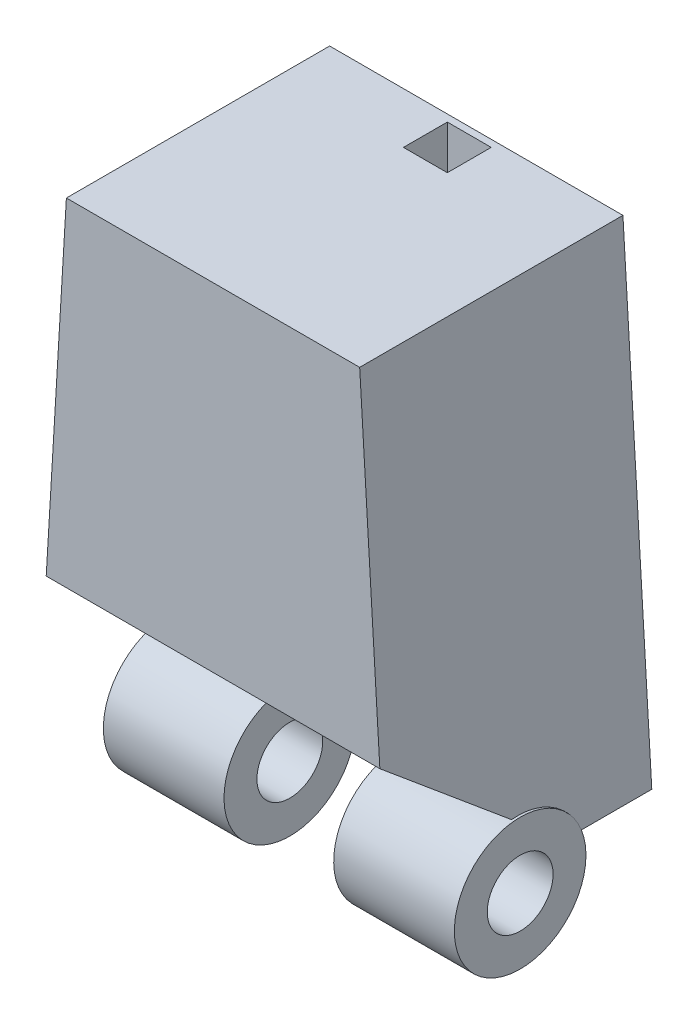
ISO-10303-21;
HEADER;
FILE_DESCRIPTION(('STEP AP214'),'2;1');
FILE_NAME('part.step','',(''),(''),'','','');
FILE_SCHEMA(('AUTOMOTIVE_DESIGN { 1 0 10303 214 1 1 1 1 }'));
ENDSEC;
DATA;
#1=APPLICATION_CONTEXT('core data for automotive mechanical design processes');
#2=APPLICATION_PROTOCOL_DEFINITION('international standard','automotive_design',2000,#1);
#3=PRODUCT_CONTEXT('',#1,'mechanical');
#4=PRODUCT('Part','Part','',(#3));
#5=PRODUCT_RELATED_PRODUCT_CATEGORY('part','',(#4));
#6=PRODUCT_DEFINITION_FORMATION('','',#4);
#7=PRODUCT_DEFINITION_CONTEXT('part definition',#1,'design');
#8=PRODUCT_DEFINITION('design','',#6,#7);
#9=PRODUCT_DEFINITION_SHAPE('','',#8);
#10=(LENGTH_UNIT() NAMED_UNIT(*) SI_UNIT(.MILLI.,.METRE.));
#11=(NAMED_UNIT(*) PLANE_ANGLE_UNIT() SI_UNIT($,.RADIAN.));
#12=(NAMED_UNIT(*) SI_UNIT($,.STERADIAN.) SOLID_ANGLE_UNIT());
#13=UNCERTAINTY_MEASURE_WITH_UNIT(LENGTH_MEASURE(1.E-05),#10,'distance_accuracy_value','');
#14=(GEOMETRIC_REPRESENTATION_CONTEXT(3) GLOBAL_UNCERTAINTY_ASSIGNED_CONTEXT((#13)) GLOBAL_UNIT_ASSIGNED_CONTEXT((#10,
#11,#12)) REPRESENTATION_CONTEXT('',''));
#15=CARTESIAN_POINT('',(0.,0.,0.));
#16=DIRECTION('',(0.,0.,1.));
#17=DIRECTION('',(1.,0.,0.));
#18=AXIS2_PLACEMENT_3D('',#15,#16,#17);
#19=CARTESIAN_POINT('',(-56.5742777997626,0.,12.));
#20=DIRECTION('',(0.,1.,0.));
#21=DIRECTION('',(0.,0.,1.));
#22=AXIS2_PLACEMENT_3D('',#19,#20,#21);
#23=PLANE('',#22);
#24=DIRECTION('',(-1.,0.,0.));
#25=VECTOR('',#24,1.);
#26=CARTESIAN_POINT('',(-40.5742777997626,0.,3.20894285260943));
#27=LINE('',#26,#25);
#28=CARTESIAN_POINT('',(-56.5742777997626,0.,3.20894285260943));
#29=VERTEX_POINT('',#28);
#30=CARTESIAN_POINT('',(-51.0742777997626,0.,3.20894285260943));
#31=VERTEX_POINT('',#30);
#32=EDGE_CURVE('E294',#29,#31,#27,.F.);
#33=ORIENTED_EDGE('',*,*,#32,.F.);
#34=DIRECTION('',(0.,0.,-1.));
#35=VECTOR('',#34,1.);
#36=CARTESIAN_POINT('',(-56.5742777997626,0.,12.));
#37=LINE('',#36,#35);
#38=CARTESIAN_POINT('',(-56.5742777997626,0.,0.));
#39=VERTEX_POINT('',#38);
#40=EDGE_CURVE('E340',#29,#39,#37,.T.);
#41=ORIENTED_EDGE('',*,*,#40,.T.);
#42=DIRECTION('',(1.,0.,0.));
#43=VECTOR('',#42,1.);
#44=CARTESIAN_POINT('',(-56.5742777997626,0.,0.));
#45=LINE('',#44,#43);
#46=CARTESIAN_POINT('',(-40.5742777997626,0.,0.));
#47=VERTEX_POINT('',#46);
#48=EDGE_CURVE('E324',#39,#47,#45,.T.);
#49=ORIENTED_EDGE('',*,*,#48,.T.);
#50=DIRECTION('',(0.,0.,-1.));
#51=VECTOR('',#50,1.);
#52=CARTESIAN_POINT('',(-40.5742777997626,0.,12.));
#53=LINE('',#52,#51);
#54=CARTESIAN_POINT('',(-40.5742777997626,0.,3.20894285260943));
#55=VERTEX_POINT('',#54);
#56=EDGE_CURVE('E337',#55,#47,#53,.T.);
#57=ORIENTED_EDGE('',*,*,#56,.F.);
#58=CARTESIAN_POINT('',(-46.0742777997626,0.,3.20894285260943));
#59=VERTEX_POINT('',#58);
#60=EDGE_CURVE('E293',#59,#55,#27,.F.);
#61=ORIENTED_EDGE('',*,*,#60,.F.);
#62=EDGE_CURVE('E299',#31,#59,#27,.F.);
#63=ORIENTED_EDGE('',*,*,#62,.F.);
#64=EDGE_LOOP('',(#33,#41,#49,#57,#61,#63));
#65=FACE_BOUND('',#64,.T.);
#66=DIRECTION('',(0.,0.,-1.));
#67=VECTOR('',#66,1.);
#68=CARTESIAN_POINT('',(-49.5742777997626,0.,12.));
#69=LINE('',#68,#67);
#70=CARTESIAN_POINT('',(-49.5742777997626,0.,2.32));
#71=VERTEX_POINT('',#70);
#72=CARTESIAN_POINT('',(-49.5742777997626,0.,0.32));
#73=VERTEX_POINT('',#72);
#74=EDGE_CURVE('E162',#71,#73,#69,.T.);
#75=ORIENTED_EDGE('',*,*,#74,.F.);
#76=DIRECTION('',(1.,0.,0.));
#77=VECTOR('',#76,1.);
#78=CARTESIAN_POINT('',(-56.5742777997626,0.,2.32));
#79=LINE('',#78,#77);
#80=CARTESIAN_POINT('',(-47.5742777997626,0.,2.32));
#81=VERTEX_POINT('',#80);
#82=EDGE_CURVE('E196',#71,#81,#79,.T.);
#83=ORIENTED_EDGE('',*,*,#82,.T.);
#84=DIRECTION('',(0.,0.,-1.));
#85=VECTOR('',#84,1.);
#86=CARTESIAN_POINT('',(-47.5742777997626,0.,12.));
#87=LINE('',#86,#85);
#88=CARTESIAN_POINT('',(-47.5742777997626,0.,0.319999999999999));
#89=VERTEX_POINT('',#88);
#90=EDGE_CURVE('E189',#81,#89,#87,.T.);
#91=ORIENTED_EDGE('',*,*,#90,.T.);
#92=DIRECTION('',(-1.,0.,0.));
#93=VECTOR('',#92,1.);
#94=CARTESIAN_POINT('',(-56.5742777997626,0.,0.320000000000001));
#95=LINE('',#94,#93);
#96=EDGE_CURVE('E200',#89,#73,#95,.T.);
#97=ORIENTED_EDGE('',*,*,#96,.T.);
#98=EDGE_LOOP('',(#75,#83,#91,#97));
#99=FACE_BOUND('',#98,.T.);
#100=ADVANCED_FACE('F40',(#65,#99),#23,.F.);
#101=CARTESIAN_POINT('',(-56.5742777997626,22.,12.));
#102=DIRECTION('',(0.,-1.,0.));
#103=DIRECTION('',(0.,0.,-1.));
#104=AXIS2_PLACEMENT_3D('',#101,#102,#103);
#105=PLANE('',#104);
#106=DIRECTION('',(1.,0.,0.));
#107=VECTOR('',#106,1.);
#108=CARTESIAN_POINT('',(-56.5742777997626,22.,12.));
#109=LINE('',#108,#107);
#110=CARTESIAN_POINT('',(-55.2586799133808,22.,12.));
#111=VERTEX_POINT('',#110);
#112=CARTESIAN_POINT('',(-41.8898756861443,22.,12.));
#113=VERTEX_POINT('',#112);
#114=EDGE_CURVE('E203',#111,#113,#109,.T.);
#115=ORIENTED_EDGE('',*,*,#114,.T.);
#116=DIRECTION('',(0.,0.,-1.));
#117=VECTOR('',#116,1.);
#118=CARTESIAN_POINT('',(-41.8898756861443,22.,12.));
#119=LINE('',#118,#117);
#120=CARTESIAN_POINT('',(-41.8898756861443,22.,0.));
#121=VERTEX_POINT('',#120);
#122=EDGE_CURVE('E334',#113,#121,#119,.T.);
#123=ORIENTED_EDGE('',*,*,#122,.T.);
#124=DIRECTION('',(1.,0.,0.));
#125=VECTOR('',#124,1.);
#126=CARTESIAN_POINT('',(-48.5742777997626,22.,0.));
#127=LINE('',#126,#125);
#128=CARTESIAN_POINT('',(-55.2586799133808,22.,0.));
#129=VERTEX_POINT('',#128);
#130=EDGE_CURVE('E11',#129,#121,#127,.T.);
#131=ORIENTED_EDGE('',*,*,#130,.F.);
#132=DIRECTION('',(0.,0.,-1.));
#133=VECTOR('',#132,1.);
#134=CARTESIAN_POINT('',(-55.2586799133808,22.,12.));
#135=LINE('',#134,#133);
#136=EDGE_CURVE('E320',#111,#129,#135,.T.);
#137=ORIENTED_EDGE('',*,*,#136,.F.);
#138=EDGE_LOOP('',(#115,#123,#131,#137));
#139=FACE_BOUND('',#138,.T.);
#140=DIRECTION('',(0.,0.,1.));
#141=VECTOR('',#140,1.);
#142=CARTESIAN_POINT('',(-49.5742777997626,22.,0.32));
#143=LINE('',#142,#141);
#144=CARTESIAN_POINT('',(-49.5742777997626,22.,0.32));
#145=VERTEX_POINT('',#144);
#146=CARTESIAN_POINT('',(-49.5742777997626,22.,2.32));
#147=VERTEX_POINT('',#146);
#148=EDGE_CURVE('E160',#145,#147,#143,.T.);
#149=ORIENTED_EDGE('',*,*,#148,.F.);
#150=DIRECTION('',(1.,0.,0.));
#151=VECTOR('',#150,1.);
#152=CARTESIAN_POINT('',(-49.5742777997626,22.,0.32));
#153=LINE('',#152,#151);
#154=CARTESIAN_POINT('',(-47.5742777997626,22.,0.32));
#155=VERTEX_POINT('',#154);
#156=EDGE_CURVE('E169',#145,#155,#153,.T.);
#157=ORIENTED_EDGE('',*,*,#156,.T.);
#158=DIRECTION('',(0.,0.,1.));
#159=VECTOR('',#158,1.);
#160=CARTESIAN_POINT('',(-47.5742777997626,22.,0.32));
#161=LINE('',#160,#159);
#162=CARTESIAN_POINT('',(-47.5742777997626,22.,2.32));
#163=VERTEX_POINT('',#162);
#164=EDGE_CURVE('E185',#155,#163,#161,.T.);
#165=ORIENTED_EDGE('',*,*,#164,.T.);
#166=DIRECTION('',(1.,0.,0.));
#167=VECTOR('',#166,1.);
#168=CARTESIAN_POINT('',(-49.5742777997626,22.,2.32));
#169=LINE('',#168,#167);
#170=EDGE_CURVE('E64',#147,#163,#169,.T.);
#171=ORIENTED_EDGE('',*,*,#170,.F.);
#172=EDGE_LOOP('',(#149,#157,#165,#171));
#173=FACE_BOUND('',#172,.T.);
#174=ADVANCED_FACE('F175',(#139,#173),#105,.F.);
#175=CARTESIAN_POINT('',(-56.5742777997626,-1.96433929006934,1.62400644488252));
#176=DIRECTION('',(0.,0.770712909441233,-0.637182557216242));
#177=DIRECTION('',(0.,0.637182557216242,0.770712909441233));
#178=AXIS2_PLACEMENT_3D('',#175,#176,#177);
#179=PLANE('',#178);
#180=DIRECTION('',(-1.,0.,0.));
#181=VECTOR('',#180,1.);
#182=CARTESIAN_POINT('',(-40.5742777997626,1.88670778135651,6.28209329801413));
#183=LINE('',#182,#181);
#184=CARTESIAN_POINT('',(-40.687102743825,1.88670778135651,6.28209329801413));
#185=VERTEX_POINT('',#184);
#186=CARTESIAN_POINT('',(-46.0742777997626,1.88670778135651,6.28209329801413));
#187=VERTEX_POINT('',#186);
#188=EDGE_CURVE('E348',#185,#187,#183,.T.);
#189=ORIENTED_EDGE('',*,*,#188,.F.);
#190=DIRECTION('',(0.0380758250929246,-0.636720506102474,-0.770154029173452));
#191=VECTOR('',#190,1.);
#192=CARTESIAN_POINT('',(-40.8088718006379,3.92298290585744,8.74509782921682));
#193=LINE('',#192,#191);
#194=CARTESIAN_POINT('',(-40.9697916699819,6.6139549439046,12.));
#195=VERTEX_POINT('',#194);
#196=EDGE_CURVE('E303',#195,#185,#193,.T.);
#197=ORIENTED_EDGE('',*,*,#196,.F.);
#198=DIRECTION('',(-1.,0.,0.));
#199=VECTOR('',#198,1.);
#200=CARTESIAN_POINT('',(-48.5742777997626,6.6139549439046,12.));
#201=LINE('',#200,#199);
#202=CARTESIAN_POINT('',(-56.1787639295432,6.61395494390459,12.));
#203=VERTEX_POINT('',#202);
#204=EDGE_CURVE('E343',#195,#203,#201,.T.);
#205=ORIENTED_EDGE('',*,*,#204,.T.);
#206=DIRECTION('',(0.0380758250929246,0.636720506102474,0.770154029173452));
#207=VECTOR('',#206,1.);
#208=CARTESIAN_POINT('',(-56.3396837988872,3.92298290585744,8.74509782921682));
#209=LINE('',#208,#207);
#210=CARTESIAN_POINT('',(-56.4614528557002,1.88670778135651,6.28209329801413));
#211=VERTEX_POINT('',#210);
#212=EDGE_CURVE('E307',#211,#203,#209,.T.);
#213=ORIENTED_EDGE('',*,*,#212,.F.);
#214=CARTESIAN_POINT('',(-51.0742777997626,1.88670778135651,6.28209329801413));
#215=VERTEX_POINT('',#214);
#216=EDGE_CURVE('E347',#215,#211,#183,.T.);
#217=ORIENTED_EDGE('',*,*,#216,.F.);
#218=EDGE_CURVE('E351',#187,#215,#183,.T.);
#219=ORIENTED_EDGE('',*,*,#218,.F.);
#220=EDGE_LOOP('',(#189,#197,#205,#213,#217,#219));
#221=FACE_BOUND('',#220,.T.);
#222=DIRECTION('',(0.,-0.637182557216242,-0.770712909441233));
#223=VECTOR('',#222,1.);
#224=CARTESIAN_POINT('',(-53.5742777997626,2.61388104101718,7.16165569700607));
#225=LINE('',#224,#223);
#226=CARTESIAN_POINT('',(-53.5742777997626,5.79979382709839,11.0152202442122));
#227=VERTEX_POINT('',#226);
#228=CARTESIAN_POINT('',(-53.5742777997626,2.61388104101718,7.16165569700607));
#229=VERTEX_POINT('',#228);
#230=EDGE_CURVE('E224',#227,#229,#225,.T.);
#231=ORIENTED_EDGE('',*,*,#230,.F.);
#232=DIRECTION('',(1.,0.,0.));
#233=VECTOR('',#232,1.);
#234=CARTESIAN_POINT('',(-53.5742777997626,5.79979382709839,11.0152202442122));
#235=LINE('',#234,#233);
#236=CARTESIAN_POINT('',(-43.5742777997626,5.79979382709839,11.0152202442122));
#237=VERTEX_POINT('',#236);
#238=EDGE_CURVE('E247',#227,#237,#235,.T.);
#239=ORIENTED_EDGE('',*,*,#238,.T.);
#240=DIRECTION('',(0.,-0.637182557216242,-0.770712909441233));
#241=VECTOR('',#240,1.);
#242=CARTESIAN_POINT('',(-43.5742777997626,2.61388104101718,7.16165569700607));
#243=LINE('',#242,#241);
#244=CARTESIAN_POINT('',(-43.5742777997626,2.61388104101718,7.16165569700607));
#245=VERTEX_POINT('',#244);
#246=EDGE_CURVE('E216',#237,#245,#243,.T.);
#247=ORIENTED_EDGE('',*,*,#246,.T.);
#248=DIRECTION('',(1.,0.,0.));
#249=VECTOR('',#248,1.);
#250=CARTESIAN_POINT('',(-53.5742777997626,2.61388104101718,7.16165569700607));
#251=LINE('',#250,#249);
#252=EDGE_CURVE('E242',#229,#245,#251,.T.);
#253=ORIENTED_EDGE('',*,*,#252,.F.);
#254=EDGE_LOOP('',(#231,#239,#247,#253));
#255=FACE_BOUND('',#254,.T.);
#256=ADVANCED_FACE('F371',(#221,#255),#179,.F.);
#257=CARTESIAN_POINT('',(-40.5742777997626,-1.1,6.));
#258=DIRECTION('',(-1.,0.,0.));
#259=DIRECTION('',(0.,0.,1.));
#260=AXIS2_PLACEMENT_3D('',#257,#258,#259);
#261=CYLINDRICAL_SURFACE('',#260,3.);
#262=CARTESIAN_POINT('',(-51.0742777997626,-1.1,6.));
#263=DIRECTION('',(1.,0.,0.));
#264=DIRECTION('',(0.,0.,-1.));
#265=AXIS2_PLACEMENT_3D('',#262,#263,#264);
#266=CIRCLE('',#265,3.);
#267=EDGE_CURVE('E261',#215,#31,#266,.T.);
#268=ORIENTED_EDGE('',*,*,#267,.F.);
#269=ORIENTED_EDGE('',*,*,#216,.T.);
#270=CARTESIAN_POINT('',(-56.6400576940817,-1.1,6.));
#271=DIRECTION('',(0.998216766991548,-0.0596932667638598,0.));
#272=DIRECTION('',(-0.0596932667638598,-0.998216766991548,0.));
#273=AXIS2_PLACEMENT_3D('',#270,#271,#272);
#274=ELLIPSE('',#273,3.00535925582725,3.);
#275=EDGE_CURVE('E298',#211,#29,#274,.F.);
#276=ORIENTED_EDGE('',*,*,#275,.T.);
#277=CARTESIAN_POINT('',(-56.5742777997626,-1.1,6.));
#278=DIRECTION('',(1.,0.,0.));
#279=DIRECTION('',(0.,0.,-1.));
#280=AXIS2_PLACEMENT_3D('',#277,#278,#279);
#281=CIRCLE('',#280,3.);
#282=EDGE_CURVE('E265',#29,#29,#281,.T.);
#283=ORIENTED_EDGE('',*,*,#282,.T.);
#284=ORIENTED_EDGE('',*,*,#32,.T.);
#285=EDGE_LOOP('',(#268,#269,#276,#283,#284));
#286=FACE_BOUND('',#285,.T.);
#287=ADVANCED_FACE('F413',(#286),#261,.T.);
#288=CARTESIAN_POINT('',(-40.5742777997626,-1.1,6.));
#289=DIRECTION('',(-1.,0.,0.));
#290=DIRECTION('',(0.,0.,1.));
#291=AXIS2_PLACEMENT_3D('',#288,#289,#290);
#292=CYLINDRICAL_SURFACE('',#291,1.5);
#293=CARTESIAN_POINT('',(-56.5742777997626,-1.1,6.));
#294=DIRECTION('',(1.,0.,0.));
#295=DIRECTION('',(0.,0.,-1.));
#296=AXIS2_PLACEMENT_3D('',#293,#294,#295);
#297=CIRCLE('',#296,1.5);
#298=CARTESIAN_POINT('',(-56.5742777997626,-1.1,4.5));
#299=VERTEX_POINT('',#298);
#300=EDGE_CURVE('E279',#299,#299,#297,.T.);
#301=ORIENTED_EDGE('',*,*,#300,.F.);
#302=EDGE_LOOP('',(#301));
#303=FACE_BOUND('',#302,.T.);
#304=CARTESIAN_POINT('',(-51.0742777997626,-1.1,6.));
#305=DIRECTION('',(1.,0.,0.));
#306=DIRECTION('',(0.,0.,-1.));
#307=AXIS2_PLACEMENT_3D('',#304,#305,#306);
#308=CIRCLE('',#307,1.5);
#309=CARTESIAN_POINT('',(-51.0742777997626,-1.1,4.5));
#310=VERTEX_POINT('',#309);
#311=EDGE_CURVE('E260',#310,#310,#308,.T.);
#312=ORIENTED_EDGE('',*,*,#311,.T.);
#313=EDGE_LOOP('',(#312));
#314=FACE_BOUND('',#313,.T.);
#315=ADVANCED_FACE('F423',(#303,#314),#292,.F.);
#316=CARTESIAN_POINT('',(-56.5742777997626,0.,12.));
#317=DIRECTION('',(0.998216766991548,-0.0596932667638598,0.));
#318=DIRECTION('',(0.0596932667638598,0.998216766991548,0.));
#319=AXIS2_PLACEMENT_3D('',#316,#317,#318);
#320=PLANE('',#319);
#321=ORIENTED_EDGE('',*,*,#275,.F.);
#322=ORIENTED_EDGE('',*,*,#212,.T.);
#323=DIRECTION('',(-0.0596932667638598,-0.998216766991548,0.));
#324=VECTOR('',#323,1.);
#325=CARTESIAN_POINT('',(-56.5742777997626,0.,12.));
#326=LINE('',#325,#324);
#327=EDGE_CURVE('E311',#111,#203,#326,.T.);
#328=ORIENTED_EDGE('',*,*,#327,.F.);
#329=ORIENTED_EDGE('',*,*,#136,.T.);
#330=DIRECTION('',(-0.0596932667638598,-0.998216766991548,0.));
#331=VECTOR('',#330,1.);
#332=CARTESIAN_POINT('',(-56.5742777997626,0.,0.));
#333=LINE('',#332,#331);
#334=EDGE_CURVE('E310',#129,#39,#333,.T.);
#335=ORIENTED_EDGE('',*,*,#334,.T.);
#336=ORIENTED_EDGE('',*,*,#40,.F.);
#337=EDGE_LOOP('',(#321,#322,#328,#329,#335,#336));
#338=FACE_BOUND('',#337,.T.);
#339=ADVANCED_FACE('F42',(#338),#320,.F.);
#340=CARTESIAN_POINT('',(-40.5742777997626,0.,12.));
#341=DIRECTION('',(-0.998216766991548,-0.0596932667638598,0.));
#342=DIRECTION('',(0.0596932667638598,-0.998216766991548,0.));
#343=AXIS2_PLACEMENT_3D('',#340,#341,#342);
#344=PLANE('',#343);
#345=CARTESIAN_POINT('',(-40.5084979054435,-1.1,6.));
#346=DIRECTION('',(-0.998216766991548,-0.0596932667638598,0.));
#347=DIRECTION('',(-0.0596932667638598,0.998216766991548,0.));
#348=AXIS2_PLACEMENT_3D('',#345,#346,#347);
#349=ELLIPSE('',#348,3.00535925582725,3.);
#350=EDGE_CURVE('E283',#55,#185,#349,.F.);
#351=ORIENTED_EDGE('',*,*,#350,.F.);
#352=ORIENTED_EDGE('',*,*,#56,.T.);
#353=DIRECTION('',(-0.0596932667638598,0.998216766991548,0.));
#354=VECTOR('',#353,1.);
#355=CARTESIAN_POINT('',(-40.5742777997626,0.,0.));
#356=LINE('',#355,#354);
#357=EDGE_CURVE('E316',#47,#121,#356,.T.);
#358=ORIENTED_EDGE('',*,*,#357,.T.);
#359=ORIENTED_EDGE('',*,*,#122,.F.);
#360=DIRECTION('',(-0.0596932667638598,0.998216766991548,0.));
#361=VECTOR('',#360,1.);
#362=CARTESIAN_POINT('',(-40.5742777997626,0.,12.));
#363=LINE('',#362,#361);
#364=EDGE_CURVE('E315',#195,#113,#363,.T.);
#365=ORIENTED_EDGE('',*,*,#364,.F.);
#366=ORIENTED_EDGE('',*,*,#196,.T.);
#367=EDGE_LOOP('',(#351,#352,#358,#359,#365,#366));
#368=FACE_BOUND('',#367,.T.);
#369=ADVANCED_FACE('F399',(#368),#344,.F.);
#370=CARTESIAN_POINT('',(-48.5742777997626,22.,12.));
#371=DIRECTION('',(0.,0.,1.));
#372=DIRECTION('',(1.,0.,0.));
#373=AXIS2_PLACEMENT_3D('',#370,#371,#372);
#374=PLANE('',#373);
#375=ORIENTED_EDGE('',*,*,#114,.F.);
#376=ORIENTED_EDGE('',*,*,#327,.T.);
#377=ORIENTED_EDGE('',*,*,#204,.F.);
#378=ORIENTED_EDGE('',*,*,#364,.T.);
#379=EDGE_LOOP('',(#375,#376,#377,#378));
#380=FACE_BOUND('',#379,.T.);
#381=ADVANCED_FACE('F402',(#380),#374,.T.);
#382=CARTESIAN_POINT('',(-48.5742777997626,22.,0.));
#383=DIRECTION('',(0.,0.,1.));
#384=DIRECTION('',(1.,0.,0.));
#385=AXIS2_PLACEMENT_3D('',#382,#383,#384);
#386=PLANE('',#385);
#387=ORIENTED_EDGE('',*,*,#334,.F.);
#388=ORIENTED_EDGE('',*,*,#130,.T.);
#389=ORIENTED_EDGE('',*,*,#357,.F.);
#390=ORIENTED_EDGE('',*,*,#48,.F.);
#391=EDGE_LOOP('',(#387,#388,#389,#390));
#392=FACE_BOUND('',#391,.T.);
#393=ADVANCED_FACE('F404',(#392),#386,.F.);
#394=ORIENTED_EDGE('',*,*,#188,.T.);
#395=CARTESIAN_POINT('',(-46.0742777997626,-1.1,6.));
#396=DIRECTION('',(1.,0.,0.));
#397=DIRECTION('',(0.,0.,-1.));
#398=AXIS2_PLACEMENT_3D('',#395,#396,#397);
#399=CIRCLE('',#398,3.);
#400=EDGE_CURVE('E246',#187,#59,#399,.T.);
#401=ORIENTED_EDGE('',*,*,#400,.T.);
#402=ORIENTED_EDGE('',*,*,#60,.T.);
#403=CARTESIAN_POINT('',(-40.5742777997626,-1.1,6.));
#404=DIRECTION('',(1.,0.,0.));
#405=DIRECTION('',(0.,0.,-1.));
#406=AXIS2_PLACEMENT_3D('',#403,#404,#405);
#407=CIRCLE('',#406,3.);
#408=EDGE_CURVE('E274',#55,#55,#407,.T.);
#409=ORIENTED_EDGE('',*,*,#408,.F.);
#410=ORIENTED_EDGE('',*,*,#350,.T.);
#411=EDGE_LOOP('',(#394,#401,#402,#409,#410));
#412=FACE_BOUND('',#411,.T.);
#413=ADVANCED_FACE('F406',(#412),#261,.T.);
#414=CARTESIAN_POINT('',(-46.0742777997626,-1.1,6.));
#415=DIRECTION('',(1.,0.,0.));
#416=DIRECTION('',(0.,0.,-1.));
#417=AXIS2_PLACEMENT_3D('',#414,#415,#416);
#418=CIRCLE('',#417,1.5);
#419=CARTESIAN_POINT('',(-46.0742777997626,-1.1,4.5));
#420=VERTEX_POINT('',#419);
#421=EDGE_CURVE('E270',#420,#420,#418,.T.);
#422=ORIENTED_EDGE('',*,*,#421,.F.);
#423=EDGE_LOOP('',(#422));
#424=FACE_BOUND('',#423,.T.);
#425=CARTESIAN_POINT('',(-40.5742777997626,-1.1,6.));
#426=DIRECTION('',(1.,0.,0.));
#427=DIRECTION('',(0.,0.,-1.));
#428=AXIS2_PLACEMENT_3D('',#425,#426,#427);
#429=CIRCLE('',#428,1.5);
#430=CARTESIAN_POINT('',(-40.5742777997626,-1.1,4.5));
#431=VERTEX_POINT('',#430);
#432=EDGE_CURVE('E278',#431,#431,#429,.T.);
#433=ORIENTED_EDGE('',*,*,#432,.T.);
#434=EDGE_LOOP('',(#433));
#435=FACE_BOUND('',#434,.T.);
#436=ADVANCED_FACE('F417',(#424,#435),#292,.F.);
#437=CARTESIAN_POINT('',(-40.5742777997626,0.,0.));
#438=DIRECTION('',(1.,0.,0.));
#439=DIRECTION('',(0.,0.,-1.));
#440=AXIS2_PLACEMENT_3D('',#437,#438,#439);
#441=PLANE('',#440);
#442=ORIENTED_EDGE('',*,*,#408,.T.);
#443=EDGE_LOOP('',(#442));
#444=FACE_BOUND('',#443,.T.);
#445=ORIENTED_EDGE('',*,*,#432,.F.);
#446=EDGE_LOOP('',(#445));
#447=FACE_BOUND('',#446,.T.);
#448=ADVANCED_FACE('F421',(#444,#447),#441,.T.);
#449=CARTESIAN_POINT('',(-56.5742777997626,0.,0.));
#450=DIRECTION('',(1.,0.,0.));
#451=DIRECTION('',(0.,0.,-1.));
#452=AXIS2_PLACEMENT_3D('',#449,#450,#451);
#453=PLANE('',#452);
#454=ORIENTED_EDGE('',*,*,#282,.F.);
#455=EDGE_LOOP('',(#454));
#456=FACE_BOUND('',#455,.T.);
#457=ORIENTED_EDGE('',*,*,#300,.T.);
#458=EDGE_LOOP('',(#457));
#459=FACE_BOUND('',#458,.T.);
#460=ADVANCED_FACE('F424',(#456,#459),#453,.F.);
#461=CARTESIAN_POINT('',(-51.0742777997626,-1.1,6.));
#462=DIRECTION('',(1.,0.,0.));
#463=DIRECTION('',(0.,0.,-1.));
#464=AXIS2_PLACEMENT_3D('',#461,#462,#463);
#465=CYLINDRICAL_SURFACE('',#464,3.);
#466=EDGE_CURVE('E266',#59,#187,#399,.T.);
#467=ORIENTED_EDGE('',*,*,#466,.T.);
#468=ORIENTED_EDGE('',*,*,#218,.T.);
#469=EDGE_CURVE('E256',#31,#215,#266,.T.);
#470=ORIENTED_EDGE('',*,*,#469,.F.);
#471=ORIENTED_EDGE('',*,*,#62,.T.);
#472=EDGE_LOOP('',(#467,#468,#470,#471));
#473=FACE_BOUND('',#472,.T.);
#474=ADVANCED_FACE('F427',(#473),#465,.F.);
#475=CARTESIAN_POINT('',(-51.0742777997626,0.,0.));
#476=DIRECTION('',(1.,0.,0.));
#477=DIRECTION('',(0.,0.,-1.));
#478=AXIS2_PLACEMENT_3D('',#475,#476,#477);
#479=PLANE('',#478);
#480=ORIENTED_EDGE('',*,*,#469,.T.);
#481=ORIENTED_EDGE('',*,*,#267,.T.);
#482=EDGE_LOOP('',(#480,#481));
#483=FACE_BOUND('',#482,.T.);
#484=ORIENTED_EDGE('',*,*,#311,.F.);
#485=EDGE_LOOP('',(#484));
#486=FACE_BOUND('',#485,.T.);
#487=ADVANCED_FACE('F434',(#483,#486),#479,.T.);
#488=CARTESIAN_POINT('',(-46.0742777997626,0.,0.));
#489=DIRECTION('',(1.,0.,0.));
#490=DIRECTION('',(0.,0.,-1.));
#491=AXIS2_PLACEMENT_3D('',#488,#489,#490);
#492=PLANE('',#491);
#493=ORIENTED_EDGE('',*,*,#466,.F.);
#494=ORIENTED_EDGE('',*,*,#400,.F.);
#495=EDGE_LOOP('',(#493,#494));
#496=FACE_BOUND('',#495,.T.);
#497=ORIENTED_EDGE('',*,*,#421,.T.);
#498=EDGE_LOOP('',(#497));
#499=FACE_BOUND('',#498,.T.);
#500=ADVANCED_FACE('F436',(#496,#499),#492,.F.);
#501=CARTESIAN_POINT('',(-53.5742777997626,2.61388104101718,7.16165569700607));
#502=DIRECTION('',(0.,-0.637182557216242,-0.770712909441233));
#503=DIRECTION('',(0.,0.770712909441233,-0.637182557216242));
#504=AXIS2_PLACEMENT_3D('',#501,#502,#503);
#505=PLANE('',#504);
#506=DIRECTION('',(0.,0.770712909441233,-0.637182557216243));
#507=VECTOR('',#506,1.);
#508=CARTESIAN_POINT('',(-43.5742777997626,2.61388104101718,7.16165569700607));
#509=LINE('',#508,#507);
#510=CARTESIAN_POINT('',(-43.5742777997626,6.46744558822334,3.97574291092486));
#511=VERTEX_POINT('',#510);
#512=EDGE_CURVE('E210',#245,#511,#509,.T.);
#513=ORIENTED_EDGE('',*,*,#512,.T.);
#514=DIRECTION('',(1.,0.,0.));
#515=VECTOR('',#514,1.);
#516=CARTESIAN_POINT('',(-53.5742777997626,6.46744558822334,3.97574291092486));
#517=LINE('',#516,#515);
#518=CARTESIAN_POINT('',(-53.5742777997626,6.46744558822334,3.97574291092486));
#519=VERTEX_POINT('',#518);
#520=EDGE_CURVE('E228',#519,#511,#517,.T.);
#521=ORIENTED_EDGE('',*,*,#520,.F.);
#522=DIRECTION('',(0.,0.770712909441233,-0.637182557216243));
#523=VECTOR('',#522,1.);
#524=CARTESIAN_POINT('',(-53.5742777997626,2.61388104101718,7.16165569700607));
#525=LINE('',#524,#523);
#526=EDGE_CURVE('E211',#229,#519,#525,.T.);
#527=ORIENTED_EDGE('',*,*,#526,.F.);
#528=ORIENTED_EDGE('',*,*,#252,.T.);
#529=EDGE_LOOP('',(#513,#521,#527,#528));
#530=FACE_BOUND('',#529,.T.);
#531=ADVANCED_FACE('F368',(#530),#505,.F.);
#532=CARTESIAN_POINT('',(-53.5742777997626,9.65335837430456,7.82930745813102));
#533=DIRECTION('',(0.,0.637182557216242,0.770712909441233));
#534=DIRECTION('',(0.,-0.770712909441233,0.637182557216243));
#535=AXIS2_PLACEMENT_3D('',#532,#533,#534);
#536=PLANE('',#535);
#537=DIRECTION('',(0.,-0.770712909441233,0.637182557216242));
#538=VECTOR('',#537,1.);
#539=CARTESIAN_POINT('',(-43.5742777997626,9.65335837430456,7.82930745813102));
#540=LINE('',#539,#538);
#541=CARTESIAN_POINT('',(-43.5742777997626,9.65335837430456,7.82930745813102));
#542=VERTEX_POINT('',#541);
#543=EDGE_CURVE('E236',#542,#237,#540,.T.);
#544=ORIENTED_EDGE('',*,*,#543,.T.);
#545=ORIENTED_EDGE('',*,*,#238,.F.);
#546=DIRECTION('',(0.,-0.770712909441233,0.637182557216242));
#547=VECTOR('',#546,1.);
#548=CARTESIAN_POINT('',(-53.5742777997626,9.65335837430456,7.82930745813102));
#549=LINE('',#548,#547);
#550=CARTESIAN_POINT('',(-53.5742777997626,9.65335837430456,7.82930745813102));
#551=VERTEX_POINT('',#550);
#552=EDGE_CURVE('E220',#551,#227,#549,.T.);
#553=ORIENTED_EDGE('',*,*,#552,.F.);
#554=DIRECTION('',(1.,0.,0.));
#555=VECTOR('',#554,1.);
#556=CARTESIAN_POINT('',(-53.5742777997626,9.65335837430456,7.82930745813102));
#557=LINE('',#556,#555);
#558=EDGE_CURVE('E251',#551,#542,#557,.T.);
#559=ORIENTED_EDGE('',*,*,#558,.T.);
#560=EDGE_LOOP('',(#544,#545,#553,#559));
#561=FACE_BOUND('',#560,.T.);
#562=ADVANCED_FACE('F374',(#561),#536,.F.);
#563=CARTESIAN_POINT('',(-53.5742777997626,6.46744558822334,3.97574291092486));
#564=DIRECTION('',(0.,0.770712909441232,-0.637182557216243));
#565=DIRECTION('',(0.,0.637182557216243,0.770712909441232));
#566=AXIS2_PLACEMENT_3D('',#563,#564,#565);
#567=PLANE('',#566);
#568=DIRECTION('',(0.,0.637182557216243,0.770712909441232));
#569=VECTOR('',#568,1.);
#570=CARTESIAN_POINT('',(-43.5742777997626,6.46744558822334,3.97574291092486));
#571=LINE('',#570,#569);
#572=EDGE_CURVE('E232',#511,#542,#571,.T.);
#573=ORIENTED_EDGE('',*,*,#572,.T.);
#574=ORIENTED_EDGE('',*,*,#558,.F.);
#575=DIRECTION('',(0.,0.637182557216243,0.770712909441232));
#576=VECTOR('',#575,1.);
#577=CARTESIAN_POINT('',(-53.5742777997626,6.46744558822334,3.97574291092486));
#578=LINE('',#577,#576);
#579=EDGE_CURVE('E215',#519,#551,#578,.T.);
#580=ORIENTED_EDGE('',*,*,#579,.F.);
#581=ORIENTED_EDGE('',*,*,#520,.T.);
#582=EDGE_LOOP('',(#573,#574,#580,#581));
#583=FACE_BOUND('',#582,.T.);
#584=ADVANCED_FACE('F378',(#583),#567,.F.);
#585=CARTESIAN_POINT('',(-53.5742777997626,0.,0.));
#586=DIRECTION('',(1.,0.,0.));
#587=DIRECTION('',(0.,0.,-1.));
#588=AXIS2_PLACEMENT_3D('',#585,#586,#587);
#589=PLANE('',#588);
#590=CARTESIAN_POINT('',(-53.5742777997626,6.17711363623363,7.54809025596646));
#591=DIRECTION('',(1.,0.,0.));
#592=DIRECTION('',(0.,0.,-1.));
#593=AXIS2_PLACEMENT_3D('',#590,#591,#592);
#594=CIRCLE('',#593,1.5);
#595=CARTESIAN_POINT('',(-53.5742777997626,6.17711363623363,6.04809025596646));
#596=VERTEX_POINT('',#595);
#597=EDGE_CURVE('E206',#596,#596,#594,.F.);
#598=ORIENTED_EDGE('',*,*,#597,.T.);
#599=EDGE_LOOP('',(#598));
#600=FACE_BOUND('',#599,.T.);
#601=ORIENTED_EDGE('',*,*,#526,.T.);
#602=ORIENTED_EDGE('',*,*,#579,.T.);
#603=ORIENTED_EDGE('',*,*,#552,.T.);
#604=ORIENTED_EDGE('',*,*,#230,.T.);
#605=EDGE_LOOP('',(#601,#602,#603,#604));
#606=FACE_BOUND('',#605,.T.);
#607=ADVANCED_FACE('F361',(#600,#606),#589,.T.);
#608=CARTESIAN_POINT('',(-43.5742777997626,0.,0.));
#609=DIRECTION('',(1.,0.,0.));
#610=DIRECTION('',(0.,0.,-1.));
#611=AXIS2_PLACEMENT_3D('',#608,#609,#610);
#612=PLANE('',#611);
#613=CARTESIAN_POINT('',(-43.5742777997626,6.17711363623363,7.54809025596646));
#614=DIRECTION('',(1.,0.,0.));
#615=DIRECTION('',(0.,0.,-1.));
#616=AXIS2_PLACEMENT_3D('',#613,#614,#615);
#617=CIRCLE('',#616,1.5);
#618=CARTESIAN_POINT('',(-43.5742777997626,6.17711363623363,6.04809025596646));
#619=VERTEX_POINT('',#618);
#620=EDGE_CURVE('E49',#619,#619,#617,.F.);
#621=ORIENTED_EDGE('',*,*,#620,.F.);
#622=EDGE_LOOP('',(#621));
#623=FACE_BOUND('',#622,.T.);
#624=ORIENTED_EDGE('',*,*,#512,.F.);
#625=ORIENTED_EDGE('',*,*,#246,.F.);
#626=ORIENTED_EDGE('',*,*,#543,.F.);
#627=ORIENTED_EDGE('',*,*,#572,.F.);
#628=EDGE_LOOP('',(#624,#625,#626,#627));
#629=FACE_BOUND('',#628,.T.);
#630=ADVANCED_FACE('F358',(#623,#629),#612,.F.);
#631=CARTESIAN_POINT('',(-43.0742777997626,6.17711363623363,7.54809025596646));
#632=DIRECTION('',(-1.,0.,0.));
#633=DIRECTION('',(0.,0.,1.));
#634=AXIS2_PLACEMENT_3D('',#631,#632,#633);
#635=CYLINDRICAL_SURFACE('',#634,1.5);
#636=ORIENTED_EDGE('',*,*,#597,.F.);
#637=EDGE_LOOP('',(#636));
#638=FACE_BOUND('',#637,.T.);
#639=ORIENTED_EDGE('',*,*,#620,.T.);
#640=EDGE_LOOP('',(#639));
#641=FACE_BOUND('',#640,.T.);
#642=ADVANCED_FACE('F356',(#638,#641),#635,.T.);
#643=CARTESIAN_POINT('',(-49.5742777997626,20.5435626064412,0.32));
#644=DIRECTION('',(0.,0.,-1.));
#645=DIRECTION('',(-1.,0.,0.));
#646=AXIS2_PLACEMENT_3D('',#643,#644,#645);
#647=PLANE('',#646);
#648=DIRECTION('',(0.,1.,0.));
#649=VECTOR('',#648,1.);
#650=CARTESIAN_POINT('',(-47.5742777997626,20.5435626064412,0.32));
#651=LINE('',#650,#649);
#652=EDGE_CURVE('E56',#89,#155,#651,.T.);
#653=ORIENTED_EDGE('',*,*,#652,.T.);
#654=ORIENTED_EDGE('',*,*,#156,.F.);
#655=DIRECTION('',(0.,1.,0.));
#656=VECTOR('',#655,1.);
#657=CARTESIAN_POINT('',(-49.5742777997626,-1.5623770343661,0.32));
#658=LINE('',#657,#656);
#659=EDGE_CURVE('E155',#73,#145,#658,.T.);
#660=ORIENTED_EDGE('',*,*,#659,.F.);
#661=ORIENTED_EDGE('',*,*,#96,.F.);
#662=EDGE_LOOP('',(#653,#654,#660,#661));
#663=FACE_BOUND('',#662,.T.);
#664=ADVANCED_FACE('F170',(#663),#647,.F.);
#665=CARTESIAN_POINT('',(-49.5742777997626,20.5435626064412,2.32));
#666=DIRECTION('',(0.,0.,1.));
#667=DIRECTION('',(1.,0.,0.));
#668=AXIS2_PLACEMENT_3D('',#665,#666,#667);
#669=PLANE('',#668);
#670=DIRECTION('',(0.,-1.,0.));
#671=VECTOR('',#670,1.);
#672=CARTESIAN_POINT('',(-49.5742777997626,22.,2.32));
#673=LINE('',#672,#671);
#674=EDGE_CURVE('E166',#147,#71,#673,.T.);
#675=ORIENTED_EDGE('',*,*,#674,.F.);
#676=ORIENTED_EDGE('',*,*,#170,.T.);
#677=DIRECTION('',(0.,-1.,0.));
#678=VECTOR('',#677,1.);
#679=CARTESIAN_POINT('',(-47.5742777997626,20.5435626064412,2.32));
#680=LINE('',#679,#678);
#681=EDGE_CURVE('E180',#163,#81,#680,.T.);
#682=ORIENTED_EDGE('',*,*,#681,.T.);
#683=ORIENTED_EDGE('',*,*,#82,.F.);
#684=EDGE_LOOP('',(#675,#676,#682,#683));
#685=FACE_BOUND('',#684,.T.);
#686=ADVANCED_FACE('F635',(#685),#669,.F.);
#687=CARTESIAN_POINT('',(-49.5742777997626,0.,0.));
#688=DIRECTION('',(1.,0.,0.));
#689=DIRECTION('',(0.,0.,-1.));
#690=AXIS2_PLACEMENT_3D('',#687,#688,#689);
#691=PLANE('',#690);
#692=ORIENTED_EDGE('',*,*,#74,.T.);
#693=ORIENTED_EDGE('',*,*,#659,.T.);
#694=ORIENTED_EDGE('',*,*,#148,.T.);
#695=ORIENTED_EDGE('',*,*,#674,.T.);
#696=EDGE_LOOP('',(#692,#693,#694,#695));
#697=FACE_BOUND('',#696,.T.);
#698=ADVANCED_FACE('F157',(#697),#691,.T.);
#699=CARTESIAN_POINT('',(-47.5742777997626,0.,0.));
#700=DIRECTION('',(1.,0.,0.));
#701=DIRECTION('',(0.,0.,-1.));
#702=AXIS2_PLACEMENT_3D('',#699,#700,#701);
#703=PLANE('',#702);
#704=ORIENTED_EDGE('',*,*,#681,.F.);
#705=ORIENTED_EDGE('',*,*,#164,.F.);
#706=ORIENTED_EDGE('',*,*,#652,.F.);
#707=ORIENTED_EDGE('',*,*,#90,.F.);
#708=EDGE_LOOP('',(#704,#705,#706,#707));
#709=FACE_BOUND('',#708,.T.);
#710=ADVANCED_FACE('F648',(#709),#703,.F.);
#711=CLOSED_SHELL('',(#100,#174,#256,#287,#315,#339,#369,#381,#393,#413,#436,#448,#460,#474,
#487,#500,#531,#562,#584,#607,#630,#642,#664,#686,#698,#710));
#712=MANIFOLD_SOLID_BREP('B2',#711);
#713=ADVANCED_BREP_SHAPE_REPRESENTATION('',(#18,#712),#14);
#714=SHAPE_DEFINITION_REPRESENTATION(#9,#713);
ENDSEC;
END-ISO-10303-21;
